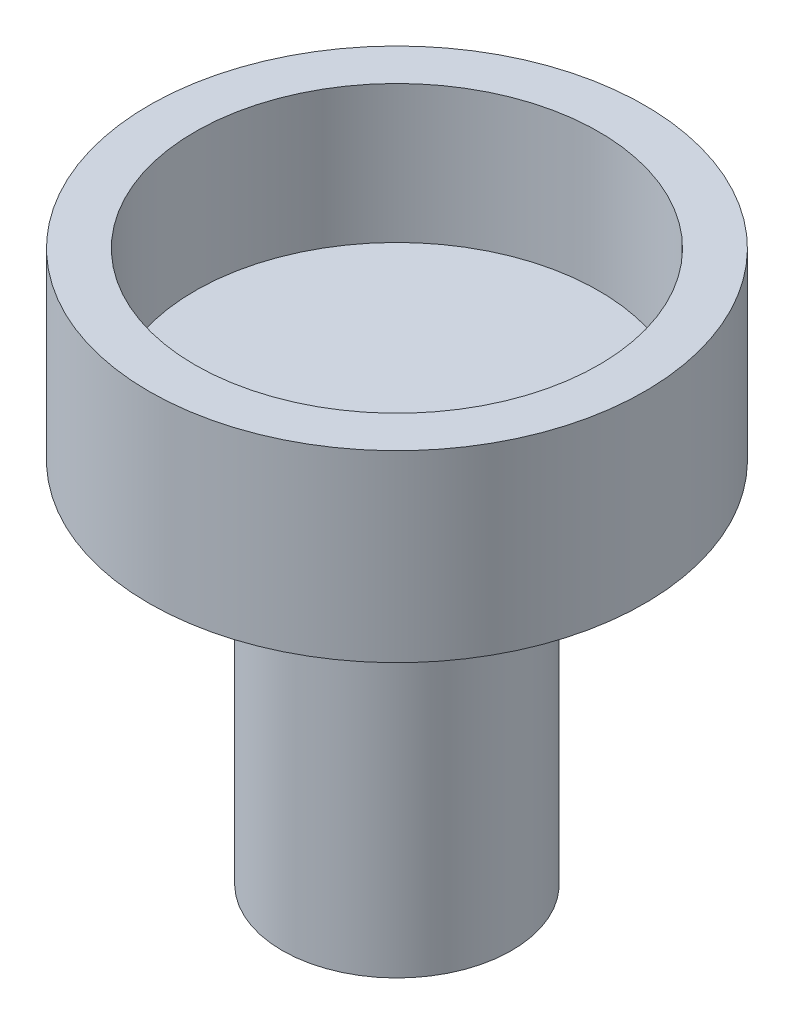
ISO-10303-21;
HEADER;
FILE_DESCRIPTION(('STEP AP214'),'2;1');
FILE_NAME('part.step','',(''),(''),'','','');
FILE_SCHEMA(('AUTOMOTIVE_DESIGN { 1 0 10303 214 1 1 1 1 }'));
ENDSEC;
DATA;
#1=APPLICATION_CONTEXT('core data for automotive mechanical design processes');
#2=APPLICATION_PROTOCOL_DEFINITION('international standard','automotive_design',2000,#1);
#3=PRODUCT_CONTEXT('',#1,'mechanical');
#4=PRODUCT('Part','Part','',(#3));
#5=PRODUCT_RELATED_PRODUCT_CATEGORY('part','',(#4));
#6=PRODUCT_DEFINITION_FORMATION('','',#4);
#7=PRODUCT_DEFINITION_CONTEXT('part definition',#1,'design');
#8=PRODUCT_DEFINITION('design','',#6,#7);
#9=PRODUCT_DEFINITION_SHAPE('','',#8);
#10=(LENGTH_UNIT() NAMED_UNIT(*) SI_UNIT(.MILLI.,.METRE.));
#11=(NAMED_UNIT(*) PLANE_ANGLE_UNIT() SI_UNIT($,.RADIAN.));
#12=(NAMED_UNIT(*) SI_UNIT($,.STERADIAN.) SOLID_ANGLE_UNIT());
#13=UNCERTAINTY_MEASURE_WITH_UNIT(LENGTH_MEASURE(1.E-05),#10,'distance_accuracy_value','');
#14=(GEOMETRIC_REPRESENTATION_CONTEXT(3) GLOBAL_UNCERTAINTY_ASSIGNED_CONTEXT((#13)) GLOBAL_UNIT_ASSIGNED_CONTEXT((#10,
#11,#12)) REPRESENTATION_CONTEXT('',''));
#15=CARTESIAN_POINT('',(0.,0.,0.));
#16=DIRECTION('',(0.,0.,1.));
#17=DIRECTION('',(1.,0.,0.));
#18=AXIS2_PLACEMENT_3D('',#15,#16,#17);
#19=CARTESIAN_POINT('',(0.,-4.,0.));
#20=DIRECTION('',(0.,1.,0.));
#21=DIRECTION('',(0.,0.,1.));
#22=AXIS2_PLACEMENT_3D('',#19,#20,#21);
#23=CYLINDRICAL_SURFACE('',#22,1.25);
#24=CARTESIAN_POINT('',(0.,-4.,0.));
#25=DIRECTION('',(0.,1.,0.));
#26=DIRECTION('',(0.,0.,1.));
#27=AXIS2_PLACEMENT_3D('',#24,#25,#26);
#28=CIRCLE('',#27,1.25);
#29=CARTESIAN_POINT('',(0.,-4.,1.25));
#30=VERTEX_POINT('',#29);
#31=EDGE_CURVE('E23',#30,#30,#28,.T.);
#32=ORIENTED_EDGE('',*,*,#31,.T.);
#33=EDGE_LOOP('',(#32));
#34=FACE_BOUND('',#33,.T.);
#35=CARTESIAN_POINT('',(0.,0.,0.));
#36=DIRECTION('',(0.,1.,0.));
#37=DIRECTION('',(0.,0.,1.));
#38=AXIS2_PLACEMENT_3D('',#35,#36,#37);
#39=CIRCLE('',#38,1.25);
#40=CARTESIAN_POINT('',(0.,0.,1.25));
#41=VERTEX_POINT('',#40);
#42=EDGE_CURVE('E27',#41,#41,#39,.T.);
#43=ORIENTED_EDGE('',*,*,#42,.F.);
#44=EDGE_LOOP('',(#43));
#45=FACE_BOUND('',#44,.T.);
#46=ADVANCED_FACE('F17',(#34,#45),#23,.T.);
#47=CARTESIAN_POINT('',(0.,-4.,0.));
#48=DIRECTION('',(0.,1.,0.));
#49=DIRECTION('',(0.,0.,1.));
#50=AXIS2_PLACEMENT_3D('',#47,#48,#49);
#51=PLANE('',#50);
#52=ORIENTED_EDGE('',*,*,#31,.F.);
#53=EDGE_LOOP('',(#52));
#54=FACE_BOUND('',#53,.T.);
#55=ADVANCED_FACE('F48',(#54),#51,.F.);
#56=CARTESIAN_POINT('',(0.,0.5,0.));
#57=DIRECTION('',(0.,-1.,0.));
#58=DIRECTION('',(0.,0.,-1.));
#59=AXIS2_PLACEMENT_3D('',#56,#57,#58);
#60=CYLINDRICAL_SURFACE('',#59,2.7);
#61=CARTESIAN_POINT('',(0.,0.,0.));
#62=DIRECTION('',(0.,1.,0.));
#63=DIRECTION('',(0.,0.,1.));
#64=AXIS2_PLACEMENT_3D('',#61,#62,#63);
#65=CIRCLE('',#64,2.7);
#66=CARTESIAN_POINT('',(0.,0.,2.7));
#67=VERTEX_POINT('',#66);
#68=EDGE_CURVE('E32',#67,#67,#65,.T.);
#69=ORIENTED_EDGE('',*,*,#68,.T.);
#70=EDGE_LOOP('',(#69));
#71=FACE_BOUND('',#70,.T.);
#72=CARTESIAN_POINT('',(0.,2.,0.));
#73=DIRECTION('',(0.,1.,0.));
#74=DIRECTION('',(0.,0.,1.));
#75=AXIS2_PLACEMENT_3D('',#72,#73,#74);
#76=CIRCLE('',#75,2.7);
#77=CARTESIAN_POINT('',(0.,2.,2.7));
#78=VERTEX_POINT('',#77);
#79=EDGE_CURVE('E36',#78,#78,#76,.T.);
#80=ORIENTED_EDGE('',*,*,#79,.F.);
#81=EDGE_LOOP('',(#80));
#82=FACE_BOUND('',#81,.T.);
#83=ADVANCED_FACE('F45',(#71,#82),#60,.T.);
#84=CARTESIAN_POINT('',(0.,0.,0.));
#85=DIRECTION('',(0.,1.,0.));
#86=DIRECTION('',(0.,0.,1.));
#87=AXIS2_PLACEMENT_3D('',#84,#85,#86);
#88=PLANE('',#87);
#89=ORIENTED_EDGE('',*,*,#42,.T.);
#90=EDGE_LOOP('',(#89));
#91=FACE_BOUND('',#90,.T.);
#92=ORIENTED_EDGE('',*,*,#68,.F.);
#93=EDGE_LOOP('',(#92));
#94=FACE_BOUND('',#93,.T.);
#95=ADVANCED_FACE('F47',(#91,#94),#88,.F.);
#96=CARTESIAN_POINT('',(0.,11.6367532368147,0.));
#97=DIRECTION('',(0.,-1.,0.));
#98=DIRECTION('',(0.,0.,-1.));
#99=AXIS2_PLACEMENT_3D('',#96,#97,#98);
#100=CYLINDRICAL_SURFACE('',#99,2.2);
#101=CARTESIAN_POINT('',(0.,0.5,0.));
#102=DIRECTION('',(0.,1.,0.));
#103=DIRECTION('',(0.,0.,1.));
#104=AXIS2_PLACEMENT_3D('',#101,#102,#103);
#105=CIRCLE('',#104,2.2);
#106=CARTESIAN_POINT('',(0.,0.5,2.2));
#107=VERTEX_POINT('',#106);
#108=EDGE_CURVE('E11',#107,#107,#105,.F.);
#109=ORIENTED_EDGE('',*,*,#108,.T.);
#110=EDGE_LOOP('',(#109));
#111=FACE_BOUND('',#110,.T.);
#112=CARTESIAN_POINT('',(0.,2.,0.));
#113=DIRECTION('',(0.,1.,0.));
#114=DIRECTION('',(0.,0.,1.));
#115=AXIS2_PLACEMENT_3D('',#112,#113,#114);
#116=CIRCLE('',#115,2.2);
#117=CARTESIAN_POINT('',(0.,2.,2.2));
#118=VERTEX_POINT('',#117);
#119=EDGE_CURVE('E37',#118,#118,#116,.T.);
#120=ORIENTED_EDGE('',*,*,#119,.T.);
#121=EDGE_LOOP('',(#120));
#122=FACE_BOUND('',#121,.T.);
#123=ADVANCED_FACE('F57',(#111,#122),#100,.F.);
#124=CARTESIAN_POINT('',(0.,2.,0.));
#125=DIRECTION('',(0.,1.,0.));
#126=DIRECTION('',(0.,0.,1.));
#127=AXIS2_PLACEMENT_3D('',#124,#125,#126);
#128=PLANE('',#127);
#129=ORIENTED_EDGE('',*,*,#119,.F.);
#130=EDGE_LOOP('',(#129));
#131=FACE_BOUND('',#130,.T.);
#132=ORIENTED_EDGE('',*,*,#79,.T.);
#133=EDGE_LOOP('',(#132));
#134=FACE_BOUND('',#133,.T.);
#135=ADVANCED_FACE('F43',(#131,#134),#128,.T.);
#136=CARTESIAN_POINT('',(0.,0.5,0.));
#137=DIRECTION('',(0.,1.,0.));
#138=DIRECTION('',(0.,0.,1.));
#139=AXIS2_PLACEMENT_3D('',#136,#137,#138);
#140=PLANE('',#139);
#141=ORIENTED_EDGE('',*,*,#108,.F.);
#142=EDGE_LOOP('',(#141));
#143=FACE_BOUND('',#142,.T.);
#144=ADVANCED_FACE('F105',(#143),#140,.T.);
#145=CLOSED_SHELL('',(#46,#55,#83,#95,#123,#135,#144));
#146=MANIFOLD_SOLID_BREP('B1',#145);
#147=ADVANCED_BREP_SHAPE_REPRESENTATION('',(#18,#146),#14);
#148=SHAPE_DEFINITION_REPRESENTATION(#9,#147);
ENDSEC;
END-ISO-10303-21;
